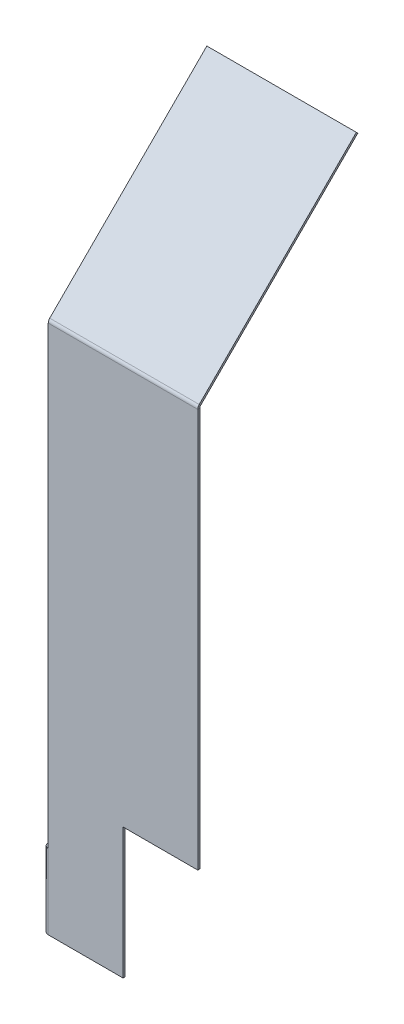
ISO-10303-21;
HEADER;
FILE_DESCRIPTION(('STEP AP214'),'2;1');
FILE_NAME('part.step','',(''),(''),'','','');
FILE_SCHEMA(('AUTOMOTIVE_DESIGN { 1 0 10303 214 1 1 1 1 }'));
ENDSEC;
DATA;
#1=APPLICATION_CONTEXT('core data for automotive mechanical design processes');
#2=APPLICATION_PROTOCOL_DEFINITION('international standard','automotive_design',2000,#1);
#3=PRODUCT_CONTEXT('',#1,'mechanical');
#4=PRODUCT('Part','Part','',(#3));
#5=PRODUCT_RELATED_PRODUCT_CATEGORY('part','',(#4));
#6=PRODUCT_DEFINITION_FORMATION('','',#4);
#7=PRODUCT_DEFINITION_CONTEXT('part definition',#1,'design');
#8=PRODUCT_DEFINITION('design','',#6,#7);
#9=PRODUCT_DEFINITION_SHAPE('','',#8);
#10=(LENGTH_UNIT() NAMED_UNIT(*) SI_UNIT(.MILLI.,.METRE.));
#11=(NAMED_UNIT(*) PLANE_ANGLE_UNIT() SI_UNIT($,.RADIAN.));
#12=(NAMED_UNIT(*) SI_UNIT($,.STERADIAN.) SOLID_ANGLE_UNIT());
#13=UNCERTAINTY_MEASURE_WITH_UNIT(LENGTH_MEASURE(1.E-05),#10,'distance_accuracy_value','');
#14=(GEOMETRIC_REPRESENTATION_CONTEXT(3) GLOBAL_UNCERTAINTY_ASSIGNED_CONTEXT((#13)) GLOBAL_UNIT_ASSIGNED_CONTEXT((#10,
#11,#12)) REPRESENTATION_CONTEXT('',''));
#15=CARTESIAN_POINT('',(0.,0.,0.));
#16=DIRECTION('',(0.,0.,1.));
#17=DIRECTION('',(1.,0.,0.));
#18=AXIS2_PLACEMENT_3D('',#15,#16,#17);
#19=CARTESIAN_POINT('',(-25.4,-110.15,-0.7));
#20=DIRECTION('',(-1.,0.,0.));
#21=DIRECTION('',(0.,0.,1.));
#22=AXIS2_PLACEMENT_3D('',#19,#20,#21);
#23=PLANE('',#22);
#24=DIRECTION('',(0.,-1.,0.));
#25=VECTOR('',#24,1.);
#26=CARTESIAN_POINT('',(-25.4,-110.15,-0.7));
#27=LINE('',#26,#25);
#28=CARTESIAN_POINT('',(-25.4,69.85,-0.699999999999973));
#29=VERTEX_POINT('',#28);
#30=CARTESIAN_POINT('',(-25.4,-84.75,-0.699999999999969));
#31=VERTEX_POINT('',#30);
#32=EDGE_CURVE('E332',#29,#31,#27,.T.);
#33=ORIENTED_EDGE('',*,*,#32,.T.);
#34=DIRECTION('',(0.,0.,1.));
#35=VECTOR('',#34,1.);
#36=CARTESIAN_POINT('',(-25.4,-84.75,-0.699999999999969));
#37=LINE('',#36,#35);
#38=CARTESIAN_POINT('',(-25.4,-84.75,0.));
#39=VERTEX_POINT('',#38);
#40=EDGE_CURVE('E287',#31,#39,#37,.T.);
#41=ORIENTED_EDGE('',*,*,#40,.T.);
#42=DIRECTION('',(0.,-1.,0.));
#43=VECTOR('',#42,1.);
#44=CARTESIAN_POINT('',(-25.4,-110.15,0.));
#45=LINE('',#44,#43);
#46=CARTESIAN_POINT('',(-25.4,69.85,0.));
#47=VERTEX_POINT('',#46);
#48=EDGE_CURVE('E346',#47,#39,#45,.T.);
#49=ORIENTED_EDGE('',*,*,#48,.F.);
#50=DIRECTION('',(0.,0.,1.));
#51=VECTOR('',#50,1.);
#52=CARTESIAN_POINT('',(-25.4,69.85,-0.7));
#53=LINE('',#52,#51);
#54=EDGE_CURVE('E86',#29,#47,#53,.T.);
#55=ORIENTED_EDGE('',*,*,#54,.F.);
#56=EDGE_LOOP('',(#33,#41,#49,#55));
#57=FACE_BOUND('',#56,.T.);
#58=ADVANCED_FACE('F77',(#57),#23,.T.);
#59=CARTESIAN_POINT('',(25.4,-110.15,-0.7));
#60=DIRECTION('',(1.,0.,0.));
#61=DIRECTION('',(0.,0.,-1.));
#62=AXIS2_PLACEMENT_3D('',#59,#60,#61);
#63=PLANE('',#62);
#64=DIRECTION('',(0.,0.,1.));
#65=VECTOR('',#64,1.);
#66=CARTESIAN_POINT('',(25.4,-65.7,-10.));
#67=LINE('',#66,#65);
#68=CARTESIAN_POINT('',(25.4,-65.7,-0.699999999999999));
#69=VERTEX_POINT('',#68);
#70=CARTESIAN_POINT('',(25.4,-65.7,0.));
#71=VERTEX_POINT('',#70);
#72=EDGE_CURVE('E94',#69,#71,#67,.T.);
#73=ORIENTED_EDGE('',*,*,#72,.F.);
#74=DIRECTION('',(0.,1.,0.));
#75=VECTOR('',#74,1.);
#76=CARTESIAN_POINT('',(25.4,-110.15,-0.7));
#77=LINE('',#76,#75);
#78=CARTESIAN_POINT('',(25.4,69.85,-0.699999999999973));
#79=VERTEX_POINT('',#78);
#80=EDGE_CURVE('E295',#69,#79,#77,.T.);
#81=ORIENTED_EDGE('',*,*,#80,.T.);
#82=DIRECTION('',(0.,0.,1.));
#83=VECTOR('',#82,1.);
#84=CARTESIAN_POINT('',(25.4,69.85,-0.7));
#85=LINE('',#84,#83);
#86=CARTESIAN_POINT('',(25.4,69.85,0.));
#87=VERTEX_POINT('',#86);
#88=EDGE_CURVE('E331',#79,#87,#85,.T.);
#89=ORIENTED_EDGE('',*,*,#88,.T.);
#90=DIRECTION('',(0.,1.,0.));
#91=VECTOR('',#90,1.);
#92=CARTESIAN_POINT('',(25.4,-110.15,0.));
#93=LINE('',#92,#91);
#94=EDGE_CURVE('E301',#71,#87,#93,.T.);
#95=ORIENTED_EDGE('',*,*,#94,.F.);
#96=EDGE_LOOP('',(#73,#81,#89,#95));
#97=FACE_BOUND('',#96,.T.);
#98=ADVANCED_FACE('F79',(#97),#63,.T.);
#99=CARTESIAN_POINT('',(-25.4,-110.15,-0.7));
#100=DIRECTION('',(0.,-1.,0.));
#101=DIRECTION('',(0.,0.,-1.));
#102=AXIS2_PLACEMENT_3D('',#99,#100,#101);
#103=PLANE('',#102);
#104=DIRECTION('',(0.,0.,1.));
#105=VECTOR('',#104,1.);
#106=CARTESIAN_POINT('',(0.,-110.15,-10.));
#107=LINE('',#106,#105);
#108=CARTESIAN_POINT('',(0.,-110.15,-0.699999999999999));
#109=VERTEX_POINT('',#108);
#110=CARTESIAN_POINT('',(0.,-110.15,0.));
#111=VERTEX_POINT('',#110);
#112=EDGE_CURVE('E244',#109,#111,#107,.T.);
#113=ORIENTED_EDGE('',*,*,#112,.T.);
#114=DIRECTION('',(1.,0.,0.));
#115=VECTOR('',#114,1.);
#116=CARTESIAN_POINT('',(-25.4,-110.15,0.));
#117=LINE('',#116,#115);
#118=CARTESIAN_POINT('',(-25.4,-110.15,0.));
#119=VERTEX_POINT('',#118);
#120=EDGE_CURVE('E327',#119,#111,#117,.T.);
#121=ORIENTED_EDGE('',*,*,#120,.F.);
#122=DIRECTION('',(0.,0.,1.));
#123=VECTOR('',#122,1.);
#124=CARTESIAN_POINT('',(-25.4,-110.15,-0.7));
#125=LINE('',#124,#123);
#126=CARTESIAN_POINT('',(-25.4,-110.15,-0.699999999999999));
#127=VERTEX_POINT('',#126);
#128=EDGE_CURVE('E13',#127,#119,#125,.T.);
#129=ORIENTED_EDGE('',*,*,#128,.F.);
#130=DIRECTION('',(1.,0.,0.));
#131=VECTOR('',#130,1.);
#132=CARTESIAN_POINT('',(-25.4,-110.15,-0.7));
#133=LINE('',#132,#131);
#134=EDGE_CURVE('E325',#127,#109,#133,.T.);
#135=ORIENTED_EDGE('',*,*,#134,.T.);
#136=EDGE_LOOP('',(#113,#121,#129,#135));
#137=FACE_BOUND('',#136,.T.);
#138=ADVANCED_FACE('F324',(#137),#103,.T.);
#139=CARTESIAN_POINT('',(0.,0.,-0.7));
#140=DIRECTION('',(0.,0.,-1.));
#141=DIRECTION('',(-1.,0.,0.));
#142=AXIS2_PLACEMENT_3D('',#139,#140,#141);
#143=PLANE('',#142);
#144=DIRECTION('',(0.,1.,0.));
#145=VECTOR('',#144,1.);
#146=CARTESIAN_POINT('',(0.,0.,-0.7));
#147=LINE('',#146,#145);
#148=CARTESIAN_POINT('',(0.,-65.7,-0.699999999999999));
#149=VERTEX_POINT('',#148);
#150=EDGE_CURVE('E252',#109,#149,#147,.T.);
#151=ORIENTED_EDGE('',*,*,#150,.F.);
#152=ORIENTED_EDGE('',*,*,#134,.F.);
#153=DIRECTION('',(0.,1.,0.));
#154=VECTOR('',#153,1.);
#155=CARTESIAN_POINT('',(-25.4,-84.75,-0.699999999999969));
#156=LINE('',#155,#154);
#157=EDGE_CURVE('E292',#31,#127,#156,.F.);
#158=ORIENTED_EDGE('',*,*,#157,.F.);
#159=ORIENTED_EDGE('',*,*,#32,.F.);
#160=DIRECTION('',(-1.,0.,0.));
#161=VECTOR('',#160,1.);
#162=CARTESIAN_POINT('',(-25.4,69.85,-0.7));
#163=LINE('',#162,#161);
#164=EDGE_CURVE('E336',#79,#29,#163,.T.);
#165=ORIENTED_EDGE('',*,*,#164,.F.);
#166=ORIENTED_EDGE('',*,*,#80,.F.);
#167=DIRECTION('',(1.,0.,0.));
#168=VECTOR('',#167,1.);
#169=CARTESIAN_POINT('',(0.,-65.7,-0.7));
#170=LINE('',#169,#168);
#171=EDGE_CURVE('E247',#149,#69,#170,.T.);
#172=ORIENTED_EDGE('',*,*,#171,.F.);
#173=EDGE_LOOP('',(#151,#152,#158,#159,#165,#166,#172));
#174=FACE_BOUND('',#173,.T.);
#175=ADVANCED_FACE('F329',(#174),#143,.T.);
#176=CARTESIAN_POINT('',(0.,0.,0.));
#177=DIRECTION('',(0.,0.,-1.));
#178=DIRECTION('',(-1.,0.,0.));
#179=AXIS2_PLACEMENT_3D('',#176,#177,#178);
#180=PLANE('',#179);
#181=ORIENTED_EDGE('',*,*,#120,.T.);
#182=DIRECTION('',(0.,-1.,0.));
#183=VECTOR('',#182,1.);
#184=CARTESIAN_POINT('',(0.,-110.15,0.));
#185=LINE('',#184,#183);
#186=CARTESIAN_POINT('',(0.,-65.7,0.));
#187=VERTEX_POINT('',#186);
#188=EDGE_CURVE('E242',#187,#111,#185,.T.);
#189=ORIENTED_EDGE('',*,*,#188,.F.);
#190=DIRECTION('',(-1.,0.,0.));
#191=VECTOR('',#190,1.);
#192=CARTESIAN_POINT('',(25.4,-65.7,0.));
#193=LINE('',#192,#191);
#194=EDGE_CURVE('E231',#71,#187,#193,.T.);
#195=ORIENTED_EDGE('',*,*,#194,.F.);
#196=ORIENTED_EDGE('',*,*,#94,.T.);
#197=DIRECTION('',(-1.,0.,0.));
#198=VECTOR('',#197,1.);
#199=CARTESIAN_POINT('',(-25.4,69.85,0.));
#200=LINE('',#199,#198);
#201=EDGE_CURVE('E343',#87,#47,#200,.T.);
#202=ORIENTED_EDGE('',*,*,#201,.T.);
#203=ORIENTED_EDGE('',*,*,#48,.T.);
#204=DIRECTION('',(0.,1.,0.));
#205=VECTOR('',#204,1.);
#206=CARTESIAN_POINT('',(-25.4,-84.75,0.));
#207=LINE('',#206,#205);
#208=EDGE_CURVE('E288',#39,#119,#207,.F.);
#209=ORIENTED_EDGE('',*,*,#208,.T.);
#210=EDGE_LOOP('',(#181,#189,#195,#196,#202,#203,#209));
#211=FACE_BOUND('',#210,.T.);
#212=ADVANCED_FACE('F357',(#211),#180,.F.);
#213=CARTESIAN_POINT('',(-25.4,-110.15,-1.7));
#214=DIRECTION('',(0.,-1.,0.));
#215=DIRECTION('',(0.,0.,-1.));
#216=AXIS2_PLACEMENT_3D('',#213,#214,#215);
#217=PLANE('',#216);
#218=DIRECTION('',(1.,0.,0.));
#219=VECTOR('',#218,1.);
#220=CARTESIAN_POINT('',(-27.1,-110.15,-1.69999999999999));
#221=LINE('',#220,#219);
#222=CARTESIAN_POINT('',(-26.4,-110.15,-1.7));
#223=VERTEX_POINT('',#222);
#224=CARTESIAN_POINT('',(-27.1,-110.15,-1.69999999999999));
#225=VERTEX_POINT('',#224);
#226=EDGE_CURVE('E254',#223,#225,#221,.F.);
#227=ORIENTED_EDGE('',*,*,#226,.F.);
#228=CARTESIAN_POINT('',(-25.4,-110.15,-1.7));
#229=DIRECTION('',(0.,1.,0.));
#230=DIRECTION('',(0.,0.,1.));
#231=AXIS2_PLACEMENT_3D('',#228,#229,#230);
#232=CIRCLE('',#231,1.);
#233=EDGE_CURVE('E289',#127,#223,#232,.F.);
#234=ORIENTED_EDGE('',*,*,#233,.F.);
#235=ORIENTED_EDGE('',*,*,#128,.T.);
#236=CARTESIAN_POINT('',(-25.4,-110.15,-1.7));
#237=DIRECTION('',(0.,1.,0.));
#238=DIRECTION('',(0.,0.,1.));
#239=AXIS2_PLACEMENT_3D('',#236,#237,#238);
#240=CIRCLE('',#239,1.7);
#241=EDGE_CURVE('E284',#119,#225,#240,.F.);
#242=ORIENTED_EDGE('',*,*,#241,.T.);
#243=EDGE_LOOP('',(#227,#234,#235,#242));
#244=FACE_BOUND('',#243,.T.);
#245=ADVANCED_FACE('F319',(#244),#217,.T.);
#246=CARTESIAN_POINT('',(-25.4,-84.75,-1.69999999999997));
#247=DIRECTION('',(0.,-1.,0.));
#248=DIRECTION('',(0.,0.,-1.));
#249=AXIS2_PLACEMENT_3D('',#246,#247,#248);
#250=PLANE('',#249);
#251=CARTESIAN_POINT('',(-25.4,-84.75,-1.69999999999997));
#252=DIRECTION('',(0.,1.,0.));
#253=DIRECTION('',(0.,0.,1.));
#254=AXIS2_PLACEMENT_3D('',#251,#252,#253);
#255=CIRCLE('',#254,1.);
#256=CARTESIAN_POINT('',(-26.4,-84.75,-1.69999999999997));
#257=VERTEX_POINT('',#256);
#258=EDGE_CURVE('E258',#257,#31,#255,.T.);
#259=ORIENTED_EDGE('',*,*,#258,.F.);
#260=DIRECTION('',(1.,0.,0.));
#261=VECTOR('',#260,1.);
#262=CARTESIAN_POINT('',(-26.4,-84.75,-1.69999999999997));
#263=LINE('',#262,#261);
#264=CARTESIAN_POINT('',(-27.1,-84.75,-1.69999999999996));
#265=VERTEX_POINT('',#264);
#266=EDGE_CURVE('E278',#257,#265,#263,.F.);
#267=ORIENTED_EDGE('',*,*,#266,.T.);
#268=CARTESIAN_POINT('',(-25.4,-84.75,-1.69999999999997));
#269=DIRECTION('',(0.,1.,0.));
#270=DIRECTION('',(0.,0.,1.));
#271=AXIS2_PLACEMENT_3D('',#268,#269,#270);
#272=CIRCLE('',#271,1.7);
#273=EDGE_CURVE('E102',#265,#39,#272,.T.);
#274=ORIENTED_EDGE('',*,*,#273,.T.);
#275=ORIENTED_EDGE('',*,*,#40,.F.);
#276=EDGE_LOOP('',(#259,#267,#274,#275));
#277=FACE_BOUND('',#276,.T.);
#278=ADVANCED_FACE('F364',(#277),#250,.F.);
#279=CARTESIAN_POINT('',(-25.4,-84.75,-1.69999999999997));
#280=DIRECTION('',(0.,1.,0.));
#281=DIRECTION('',(-1.,0.,0.));
#282=AXIS2_PLACEMENT_3D('',#279,#280,#281);
#283=CYLINDRICAL_SURFACE('',#282,1.7);
#284=ORIENTED_EDGE('',*,*,#208,.F.);
#285=ORIENTED_EDGE('',*,*,#273,.F.);
#286=DIRECTION('',(0.,1.,0.));
#287=VECTOR('',#286,1.);
#288=CARTESIAN_POINT('',(-27.1,-110.15,-1.69999999999999));
#289=LINE('',#288,#287);
#290=EDGE_CURVE('E276',#265,#225,#289,.F.);
#291=ORIENTED_EDGE('',*,*,#290,.T.);
#292=ORIENTED_EDGE('',*,*,#241,.F.);
#293=EDGE_LOOP('',(#284,#285,#291,#292));
#294=FACE_BOUND('',#293,.T.);
#295=ADVANCED_FACE('F361',(#294),#283,.T.);
#296=CARTESIAN_POINT('',(-25.4,-84.75,-1.69999999999997));
#297=DIRECTION('',(0.,1.,0.));
#298=DIRECTION('',(-1.,0.,0.));
#299=AXIS2_PLACEMENT_3D('',#296,#297,#298);
#300=CYLINDRICAL_SURFACE('',#299,1.);
#301=ORIENTED_EDGE('',*,*,#157,.T.);
#302=ORIENTED_EDGE('',*,*,#233,.T.);
#303=DIRECTION('',(0.,1.,0.));
#304=VECTOR('',#303,1.);
#305=CARTESIAN_POINT('',(-26.4,-110.15,-1.7));
#306=LINE('',#305,#304);
#307=EDGE_CURVE('E280',#223,#257,#306,.T.);
#308=ORIENTED_EDGE('',*,*,#307,.T.);
#309=ORIENTED_EDGE('',*,*,#258,.T.);
#310=EDGE_LOOP('',(#301,#302,#308,#309));
#311=FACE_BOUND('',#310,.T.);
#312=ADVANCED_FACE('F310',(#311),#300,.F.);
#313=CARTESIAN_POINT('',(-27.1,-110.15,-0.699999999999998));
#314=DIRECTION('',(0.,1.,0.));
#315=DIRECTION('',(0.,0.,1.));
#316=AXIS2_PLACEMENT_3D('',#313,#314,#315);
#317=PLANE('',#316);
#318=ORIENTED_EDGE('',*,*,#226,.T.);
#319=DIRECTION('',(0.,0.,1.));
#320=VECTOR('',#319,1.);
#321=CARTESIAN_POINT('',(-27.1,-110.15,0.));
#322=LINE('',#321,#320);
#323=CARTESIAN_POINT('',(-27.1000000000001,-110.15,-25.4));
#324=VERTEX_POINT('',#323);
#325=EDGE_CURVE('E266',#324,#225,#322,.T.);
#326=ORIENTED_EDGE('',*,*,#325,.F.);
#327=DIRECTION('',(1.,0.,0.));
#328=VECTOR('',#327,1.);
#329=CARTESIAN_POINT('',(-27.1000000000001,-110.15,-25.4));
#330=LINE('',#329,#328);
#331=CARTESIAN_POINT('',(-26.4000000000001,-110.15,-25.4));
#332=VERTEX_POINT('',#331);
#333=EDGE_CURVE('E259',#324,#332,#330,.T.);
#334=ORIENTED_EDGE('',*,*,#333,.T.);
#335=DIRECTION('',(0.,0.,-1.));
#336=VECTOR('',#335,1.);
#337=CARTESIAN_POINT('',(-26.4,-110.15,-0.7));
#338=LINE('',#337,#336);
#339=EDGE_CURVE('E273',#332,#223,#338,.F.);
#340=ORIENTED_EDGE('',*,*,#339,.T.);
#341=EDGE_LOOP('',(#318,#326,#334,#340));
#342=FACE_BOUND('',#341,.T.);
#343=ADVANCED_FACE('F382',(#342),#317,.F.);
#344=CARTESIAN_POINT('',(-27.1,-84.75,-0.699999999999969));
#345=DIRECTION('',(0.,-1.,0.));
#346=DIRECTION('',(0.,0.,-1.));
#347=AXIS2_PLACEMENT_3D('',#344,#345,#346);
#348=PLANE('',#347);
#349=ORIENTED_EDGE('',*,*,#266,.F.);
#350=DIRECTION('',(0.,0.,1.));
#351=VECTOR('',#350,1.);
#352=CARTESIAN_POINT('',(-26.4,-84.75,-0.699999999999972));
#353=LINE('',#352,#351);
#354=CARTESIAN_POINT('',(-26.4000000000001,-84.75,-25.4));
#355=VERTEX_POINT('',#354);
#356=EDGE_CURVE('E271',#257,#355,#353,.F.);
#357=ORIENTED_EDGE('',*,*,#356,.T.);
#358=DIRECTION('',(1.,0.,0.));
#359=VECTOR('',#358,1.);
#360=CARTESIAN_POINT('',(-27.1000000000001,-84.75,-25.4));
#361=LINE('',#360,#359);
#362=CARTESIAN_POINT('',(-27.1000000000001,-84.75,-25.4));
#363=VERTEX_POINT('',#362);
#364=EDGE_CURVE('E255',#363,#355,#361,.T.);
#365=ORIENTED_EDGE('',*,*,#364,.F.);
#366=DIRECTION('',(0.,0.,-1.));
#367=VECTOR('',#366,1.);
#368=CARTESIAN_POINT('',(-27.1,-84.75,0.));
#369=LINE('',#368,#367);
#370=EDGE_CURVE('E264',#265,#363,#369,.T.);
#371=ORIENTED_EDGE('',*,*,#370,.F.);
#372=EDGE_LOOP('',(#349,#357,#365,#371));
#373=FACE_BOUND('',#372,.T.);
#374=ADVANCED_FACE('F370',(#373),#348,.F.);
#375=CARTESIAN_POINT('',(-27.1,0.,0.));
#376=DIRECTION('',(1.,0.,0.));
#377=DIRECTION('',(0.,0.,-1.));
#378=AXIS2_PLACEMENT_3D('',#375,#376,#377);
#379=PLANE('',#378);
#380=ORIENTED_EDGE('',*,*,#290,.F.);
#381=ORIENTED_EDGE('',*,*,#370,.T.);
#382=DIRECTION('',(0.,-1.,0.));
#383=VECTOR('',#382,1.);
#384=CARTESIAN_POINT('',(-27.1000000000001,0.,-25.4));
#385=LINE('',#384,#383);
#386=EDGE_CURVE('E262',#363,#324,#385,.T.);
#387=ORIENTED_EDGE('',*,*,#386,.T.);
#388=ORIENTED_EDGE('',*,*,#325,.T.);
#389=EDGE_LOOP('',(#380,#381,#387,#388));
#390=FACE_BOUND('',#389,.T.);
#391=ADVANCED_FACE('F384',(#390),#379,.F.);
#392=CARTESIAN_POINT('',(-26.4,0.,0.));
#393=DIRECTION('',(1.,0.,0.));
#394=DIRECTION('',(0.,0.,-1.));
#395=AXIS2_PLACEMENT_3D('',#392,#393,#394);
#396=PLANE('',#395);
#397=ORIENTED_EDGE('',*,*,#356,.F.);
#398=ORIENTED_EDGE('',*,*,#307,.F.);
#399=ORIENTED_EDGE('',*,*,#339,.F.);
#400=DIRECTION('',(0.,1.,0.));
#401=VECTOR('',#400,1.);
#402=CARTESIAN_POINT('',(-26.4000000000001,-110.15,-25.4));
#403=LINE('',#402,#401);
#404=EDGE_CURVE('E269',#355,#332,#403,.F.);
#405=ORIENTED_EDGE('',*,*,#404,.F.);
#406=EDGE_LOOP('',(#397,#398,#399,#405));
#407=FACE_BOUND('',#406,.T.);
#408=ADVANCED_FACE('F374',(#407),#396,.T.);
#409=CARTESIAN_POINT('',(-27.1000000000001,-110.15,-25.4));
#410=DIRECTION('',(0.,0.,1.));
#411=DIRECTION('',(1.,0.,0.));
#412=AXIS2_PLACEMENT_3D('',#409,#410,#411);
#413=PLANE('',#412);
#414=ORIENTED_EDGE('',*,*,#404,.T.);
#415=ORIENTED_EDGE('',*,*,#333,.F.);
#416=ORIENTED_EDGE('',*,*,#386,.F.);
#417=ORIENTED_EDGE('',*,*,#364,.T.);
#418=EDGE_LOOP('',(#414,#415,#416,#417));
#419=FACE_BOUND('',#418,.T.);
#420=ADVANCED_FACE('F378',(#419),#413,.F.);
#421=CARTESIAN_POINT('',(0.,-110.15,-10.));
#422=DIRECTION('',(-1.,0.,0.));
#423=DIRECTION('',(0.,-1.,0.));
#424=AXIS2_PLACEMENT_3D('',#421,#422,#423);
#425=PLANE('',#424);
#426=ORIENTED_EDGE('',*,*,#150,.T.);
#427=DIRECTION('',(0.,0.,1.));
#428=VECTOR('',#427,1.);
#429=CARTESIAN_POINT('',(0.,-65.7,-10.));
#430=LINE('',#429,#428);
#431=EDGE_CURVE('E248',#149,#187,#430,.T.);
#432=ORIENTED_EDGE('',*,*,#431,.T.);
#433=ORIENTED_EDGE('',*,*,#188,.T.);
#434=ORIENTED_EDGE('',*,*,#112,.F.);
#435=EDGE_LOOP('',(#426,#432,#433,#434));
#436=FACE_BOUND('',#435,.T.);
#437=ADVANCED_FACE('F417',(#436),#425,.F.);
#438=CARTESIAN_POINT('',(25.4,-65.7,-10.));
#439=DIRECTION('',(0.,1.,0.));
#440=DIRECTION('',(0.,0.,1.));
#441=AXIS2_PLACEMENT_3D('',#438,#439,#440);
#442=PLANE('',#441);
#443=ORIENTED_EDGE('',*,*,#171,.T.);
#444=ORIENTED_EDGE('',*,*,#72,.T.);
#445=ORIENTED_EDGE('',*,*,#194,.T.);
#446=ORIENTED_EDGE('',*,*,#431,.F.);
#447=EDGE_LOOP('',(#443,#444,#445,#446));
#448=FACE_BOUND('',#447,.T.);
#449=ADVANCED_FACE('F421',(#448),#442,.F.);
#450=CARTESIAN_POINT('',(-25.4,69.85,-1.69999999999998));
#451=DIRECTION('',(-1.,0.,0.));
#452=DIRECTION('',(0.,0.,1.));
#453=AXIS2_PLACEMENT_3D('',#450,#451,#452);
#454=PLANE('',#453);
#455=DIRECTION('',(0.,-0.707106781186544,-0.707106781186551));
#456=VECTOR('',#455,1.);
#457=CARTESIAN_POINT('',(-25.4,71.0520815280171,-0.497918471982848));
#458=LINE('',#457,#456);
#459=CARTESIAN_POINT('',(-25.4,70.5571067811865,-0.992893218813423));
#460=VERTEX_POINT('',#459);
#461=CARTESIAN_POINT('',(-25.4,71.0520815280171,-0.497918471982836));
#462=VERTEX_POINT('',#461);
#463=EDGE_CURVE('E210',#460,#462,#458,.F.);
#464=ORIENTED_EDGE('',*,*,#463,.F.);
#465=CARTESIAN_POINT('',(-25.4,69.85,-1.69999999999998));
#466=DIRECTION('',(1.,0.,0.));
#467=DIRECTION('',(0.,0.,-1.));
#468=AXIS2_PLACEMENT_3D('',#465,#466,#467);
#469=CIRCLE('',#468,1.);
#470=EDGE_CURVE('E235',#29,#460,#469,.F.);
#471=ORIENTED_EDGE('',*,*,#470,.F.);
#472=ORIENTED_EDGE('',*,*,#54,.T.);
#473=CARTESIAN_POINT('',(-25.4,69.85,-1.69999999999998));
#474=DIRECTION('',(1.,0.,0.));
#475=DIRECTION('',(0.,0.,-1.));
#476=AXIS2_PLACEMENT_3D('',#473,#474,#475);
#477=CIRCLE('',#476,1.7);
#478=EDGE_CURVE('E228',#47,#462,#477,.F.);
#479=ORIENTED_EDGE('',*,*,#478,.T.);
#480=EDGE_LOOP('',(#464,#471,#472,#479));
#481=FACE_BOUND('',#480,.T.);
#482=ADVANCED_FACE('F427',(#481),#454,.T.);
#483=CARTESIAN_POINT('',(25.4,69.85,-1.69999999999998));
#484=DIRECTION('',(-1.,0.,0.));
#485=DIRECTION('',(0.,0.,1.));
#486=AXIS2_PLACEMENT_3D('',#483,#484,#485);
#487=PLANE('',#486);
#488=CARTESIAN_POINT('',(25.4,69.85,-1.69999999999998));
#489=DIRECTION('',(1.,0.,0.));
#490=DIRECTION('',(0.,0.,-1.));
#491=AXIS2_PLACEMENT_3D('',#488,#489,#490);
#492=CIRCLE('',#491,1.);
#493=CARTESIAN_POINT('',(25.4,70.5571067811865,-0.992893218813423));
#494=VERTEX_POINT('',#493);
#495=EDGE_CURVE('E238',#494,#79,#492,.T.);
#496=ORIENTED_EDGE('',*,*,#495,.F.);
#497=DIRECTION('',(0.,-0.707106781186544,-0.707106781186551));
#498=VECTOR('',#497,1.);
#499=CARTESIAN_POINT('',(25.4,70.5571067811865,-0.992893218813434));
#500=LINE('',#499,#498);
#501=CARTESIAN_POINT('',(25.4,71.0520815280171,-0.497918471982841));
#502=VERTEX_POINT('',#501);
#503=EDGE_CURVE('E222',#494,#502,#500,.F.);
#504=ORIENTED_EDGE('',*,*,#503,.T.);
#505=CARTESIAN_POINT('',(25.4,69.85,-1.69999999999998));
#506=DIRECTION('',(1.,0.,0.));
#507=DIRECTION('',(0.,0.,-1.));
#508=AXIS2_PLACEMENT_3D('',#505,#506,#507);
#509=CIRCLE('',#508,1.7);
#510=EDGE_CURVE('E232',#502,#87,#509,.T.);
#511=ORIENTED_EDGE('',*,*,#510,.T.);
#512=ORIENTED_EDGE('',*,*,#88,.F.);
#513=EDGE_LOOP('',(#496,#504,#511,#512));
#514=FACE_BOUND('',#513,.T.);
#515=ADVANCED_FACE('F429',(#514),#487,.F.);
#516=CARTESIAN_POINT('',(25.4,69.85,-1.69999999999998));
#517=DIRECTION('',(1.,0.,0.));
#518=DIRECTION('',(0.,0.707106781186544,0.707106781186551));
#519=AXIS2_PLACEMENT_3D('',#516,#517,#518);
#520=CYLINDRICAL_SURFACE('',#519,1.7);
#521=ORIENTED_EDGE('',*,*,#201,.F.);
#522=ORIENTED_EDGE('',*,*,#510,.F.);
#523=DIRECTION('',(1.,0.,0.));
#524=VECTOR('',#523,1.);
#525=CARTESIAN_POINT('',(-25.4,71.0520815280171,-0.497918471982839));
#526=LINE('',#525,#524);
#527=EDGE_CURVE('E220',#502,#462,#526,.F.);
#528=ORIENTED_EDGE('',*,*,#527,.T.);
#529=ORIENTED_EDGE('',*,*,#478,.F.);
#530=EDGE_LOOP('',(#521,#522,#528,#529));
#531=FACE_BOUND('',#530,.T.);
#532=ADVANCED_FACE('F432',(#531),#520,.T.);
#533=CARTESIAN_POINT('',(25.4,69.85,-1.69999999999998));
#534=DIRECTION('',(1.,0.,0.));
#535=DIRECTION('',(0.,0.707106781186544,0.707106781186551));
#536=AXIS2_PLACEMENT_3D('',#533,#534,#535);
#537=CYLINDRICAL_SURFACE('',#536,1.);
#538=ORIENTED_EDGE('',*,*,#164,.T.);
#539=ORIENTED_EDGE('',*,*,#470,.T.);
#540=DIRECTION('',(1.,0.,0.));
#541=VECTOR('',#540,1.);
#542=CARTESIAN_POINT('',(-25.4,70.5571067811865,-0.992893218813425));
#543=LINE('',#542,#541);
#544=EDGE_CURVE('E225',#460,#494,#543,.T.);
#545=ORIENTED_EDGE('',*,*,#544,.T.);
#546=ORIENTED_EDGE('',*,*,#495,.T.);
#547=EDGE_LOOP('',(#538,#539,#545,#546));
#548=FACE_BOUND('',#547,.T.);
#549=ADVANCED_FACE('F437',(#548),#537,.F.);
#550=CARTESIAN_POINT('',(25.4,124.435699782449,-53.8815367264146));
#551=DIRECTION('',(-1.,0.,0.));
#552=DIRECTION('',(0.,0.,1.));
#553=AXIS2_PLACEMENT_3D('',#550,#551,#552);
#554=PLANE('',#553);
#555=ORIENTED_EDGE('',*,*,#503,.F.);
#556=DIRECTION('',(0.,-0.707106781186551,0.707106781186544));
#557=VECTOR('',#556,1.);
#558=CARTESIAN_POINT('',(25.4,123.940725035619,-54.3765114732452));
#559=LINE('',#558,#557);
#560=CARTESIAN_POINT('',(25.4,123.940725035619,-54.3765114732452));
#561=VERTEX_POINT('',#560);
#562=EDGE_CURVE('E218',#494,#561,#559,.F.);
#563=ORIENTED_EDGE('',*,*,#562,.T.);
#564=DIRECTION('',(0.,-0.707106781186544,-0.707106781186551));
#565=VECTOR('',#564,1.);
#566=CARTESIAN_POINT('',(25.4,124.435699782449,-53.8815367264146));
#567=LINE('',#566,#565);
#568=CARTESIAN_POINT('',(25.4,124.435699782449,-53.8815367264146));
#569=VERTEX_POINT('',#568);
#570=EDGE_CURVE('E206',#569,#561,#567,.T.);
#571=ORIENTED_EDGE('',*,*,#570,.F.);
#572=DIRECTION('',(0.,0.707106781186551,-0.707106781186544));
#573=VECTOR('',#572,1.);
#574=CARTESIAN_POINT('',(25.4,35.4841883092033,35.0699747468306));
#575=LINE('',#574,#573);
#576=EDGE_CURVE('E193',#502,#569,#575,.T.);
#577=ORIENTED_EDGE('',*,*,#576,.F.);
#578=EDGE_LOOP('',(#555,#563,#571,#577));
#579=FACE_BOUND('',#578,.T.);
#580=ADVANCED_FACE('F440',(#579),#554,.F.);
#581=CARTESIAN_POINT('',(-25.4,70.7591883092037,-0.205025253169406));
#582=DIRECTION('',(1.,0.,0.));
#583=DIRECTION('',(0.,0.,-1.));
#584=AXIS2_PLACEMENT_3D('',#581,#582,#583);
#585=PLANE('',#584);
#586=ORIENTED_EDGE('',*,*,#463,.T.);
#587=DIRECTION('',(0.,-0.707106781186551,0.707106781186544));
#588=VECTOR('',#587,1.);
#589=CARTESIAN_POINT('',(-25.4,35.4841883092033,35.0699747468306));
#590=LINE('',#589,#588);
#591=CARTESIAN_POINT('',(-25.4,124.435699782449,-53.8815367264146));
#592=VERTEX_POINT('',#591);
#593=EDGE_CURVE('E191',#592,#462,#590,.T.);
#594=ORIENTED_EDGE('',*,*,#593,.F.);
#595=DIRECTION('',(0.,-0.707106781186544,-0.707106781186551));
#596=VECTOR('',#595,1.);
#597=CARTESIAN_POINT('',(-25.4,124.435699782449,-53.8815367264146));
#598=LINE('',#597,#596);
#599=CARTESIAN_POINT('',(-25.4,123.940725035619,-54.3765114732452));
#600=VERTEX_POINT('',#599);
#601=EDGE_CURVE('E199',#592,#600,#598,.T.);
#602=ORIENTED_EDGE('',*,*,#601,.T.);
#603=DIRECTION('',(0.,0.707106781186551,-0.707106781186544));
#604=VECTOR('',#603,1.);
#605=CARTESIAN_POINT('',(-25.4,70.2642135623731,-0.699999999999982));
#606=LINE('',#605,#604);
#607=EDGE_CURVE('E215',#600,#460,#606,.F.);
#608=ORIENTED_EDGE('',*,*,#607,.T.);
#609=EDGE_LOOP('',(#586,#594,#602,#608));
#610=FACE_BOUND('',#609,.T.);
#611=ADVANCED_FACE('F209',(#610),#585,.F.);
#612=CARTESIAN_POINT('',(0.,35.4841883092033,35.0699747468306));
#613=DIRECTION('',(0.,-0.707106781186544,-0.707106781186551));
#614=DIRECTION('',(0.,0.707106781186551,-0.707106781186544));
#615=AXIS2_PLACEMENT_3D('',#612,#613,#614);
#616=PLANE('',#615);
#617=ORIENTED_EDGE('',*,*,#527,.F.);
#618=ORIENTED_EDGE('',*,*,#576,.T.);
#619=DIRECTION('',(-1.,0.,0.));
#620=VECTOR('',#619,1.);
#621=CARTESIAN_POINT('',(0.,124.435699782449,-53.8815367264146));
#622=LINE('',#621,#620);
#623=EDGE_CURVE('E186',#569,#592,#622,.T.);
#624=ORIENTED_EDGE('',*,*,#623,.T.);
#625=ORIENTED_EDGE('',*,*,#593,.T.);
#626=EDGE_LOOP('',(#617,#618,#624,#625));
#627=FACE_BOUND('',#626,.T.);
#628=ADVANCED_FACE('F189',(#627),#616,.F.);
#629=CARTESIAN_POINT('',(0.,34.9892135623727,34.575));
#630=DIRECTION('',(0.,-0.707106781186544,-0.707106781186551));
#631=DIRECTION('',(0.,0.707106781186551,-0.707106781186544));
#632=AXIS2_PLACEMENT_3D('',#629,#630,#631);
#633=PLANE('',#632);
#634=ORIENTED_EDGE('',*,*,#562,.F.);
#635=ORIENTED_EDGE('',*,*,#544,.F.);
#636=ORIENTED_EDGE('',*,*,#607,.F.);
#637=DIRECTION('',(1.,0.,0.));
#638=VECTOR('',#637,1.);
#639=CARTESIAN_POINT('',(-25.4,123.940725035619,-54.3765114732452));
#640=LINE('',#639,#638);
#641=EDGE_CURVE('E202',#561,#600,#640,.F.);
#642=ORIENTED_EDGE('',*,*,#641,.F.);
#643=EDGE_LOOP('',(#634,#635,#636,#642));
#644=FACE_BOUND('',#643,.T.);
#645=ADVANCED_FACE('F450',(#644),#633,.T.);
#646=CARTESIAN_POINT('',(-25.4,124.435699782449,-53.8815367264146));
#647=DIRECTION('',(0.,-0.707106781186551,0.707106781186544));
#648=DIRECTION('',(0.,-0.707106781186544,-0.707106781186551));
#649=AXIS2_PLACEMENT_3D('',#646,#647,#648);
#650=PLANE('',#649);
#651=ORIENTED_EDGE('',*,*,#641,.T.);
#652=ORIENTED_EDGE('',*,*,#601,.F.);
#653=ORIENTED_EDGE('',*,*,#623,.F.);
#654=ORIENTED_EDGE('',*,*,#570,.T.);
#655=EDGE_LOOP('',(#651,#652,#653,#654));
#656=FACE_BOUND('',#655,.T.);
#657=ADVANCED_FACE('F200',(#656),#650,.F.);
#658=CLOSED_SHELL('',(#58,#98,#138,#175,#212,#245,#278,#295,#312,#343,#374,#391,#408,#420,#437,
#449,#482,#515,#532,#549,#580,#611,#628,#645,#657));
#659=MANIFOLD_SOLID_BREP('B2',#658);
#660=ADVANCED_BREP_SHAPE_REPRESENTATION('',(#18,#659),#14);
#661=SHAPE_DEFINITION_REPRESENTATION(#9,#660);
ENDSEC;
END-ISO-10303-21;
